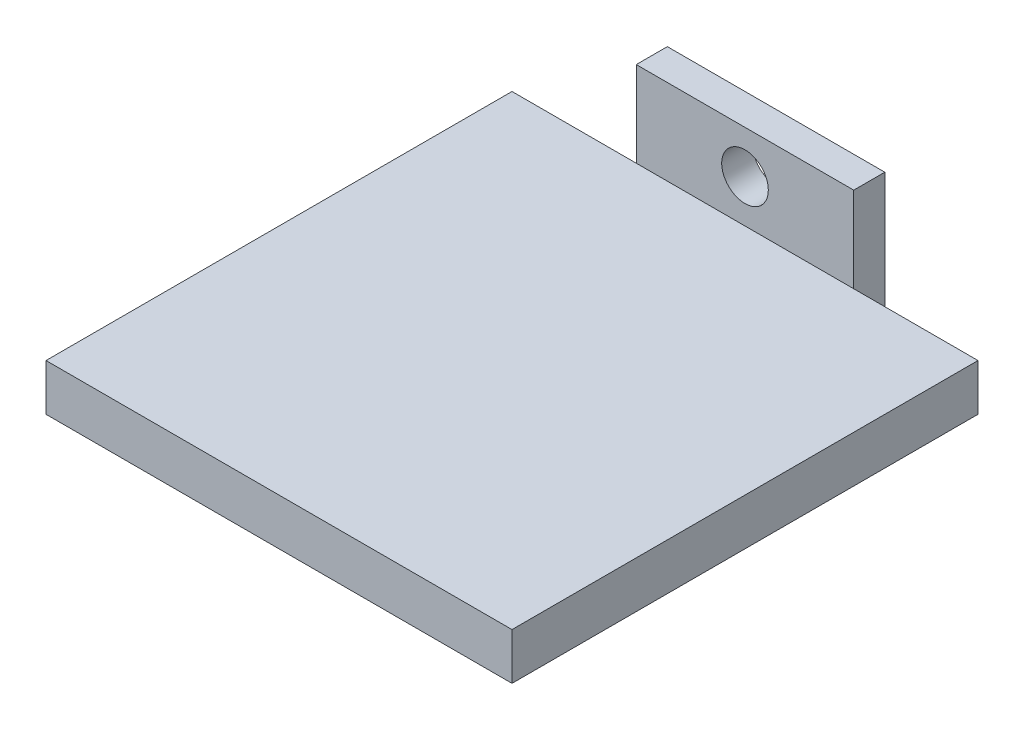
ISO-10303-21;
HEADER;
FILE_DESCRIPTION(('STEP AP214'),'2;1');
FILE_NAME('part.step','',(''),(''),'','','');
FILE_SCHEMA(('AUTOMOTIVE_DESIGN { 1 0 10303 214 1 1 1 1 }'));
ENDSEC;
DATA;
#1=APPLICATION_CONTEXT('core data for automotive mechanical design processes');
#2=APPLICATION_PROTOCOL_DEFINITION('international standard','automotive_design',2000,#1);
#3=PRODUCT_CONTEXT('',#1,'mechanical');
#4=PRODUCT('Part','Part','',(#3));
#5=PRODUCT_RELATED_PRODUCT_CATEGORY('part','',(#4));
#6=PRODUCT_DEFINITION_FORMATION('','',#4);
#7=PRODUCT_DEFINITION_CONTEXT('part definition',#1,'design');
#8=PRODUCT_DEFINITION('design','',#6,#7);
#9=PRODUCT_DEFINITION_SHAPE('','',#8);
#10=(LENGTH_UNIT() NAMED_UNIT(*) SI_UNIT(.MILLI.,.METRE.));
#11=(NAMED_UNIT(*) PLANE_ANGLE_UNIT() SI_UNIT($,.RADIAN.));
#12=(NAMED_UNIT(*) SI_UNIT($,.STERADIAN.) SOLID_ANGLE_UNIT());
#13=UNCERTAINTY_MEASURE_WITH_UNIT(LENGTH_MEASURE(1.E-05),#10,'distance_accuracy_value','');
#14=(GEOMETRIC_REPRESENTATION_CONTEXT(3) GLOBAL_UNCERTAINTY_ASSIGNED_CONTEXT((#13)) GLOBAL_UNIT_ASSIGNED_CONTEXT((#10,
#11,#12)) REPRESENTATION_CONTEXT('',''));
#15=CARTESIAN_POINT('',(0.,0.,0.));
#16=DIRECTION('',(0.,0.,1.));
#17=DIRECTION('',(1.,0.,0.));
#18=AXIS2_PLACEMENT_3D('',#15,#16,#17);
#19=CARTESIAN_POINT('',(0.,0.,2.));
#20=DIRECTION('',(0.,0.,-1.));
#21=DIRECTION('',(-1.,0.,0.));
#22=AXIS2_PLACEMENT_3D('',#19,#20,#21);
#23=PLANE('',#22);
#24=CARTESIAN_POINT('',(0.,-4.25,2.));
#25=DIRECTION('',(0.,0.,1.));
#26=DIRECTION('',(1.,0.,0.));
#27=AXIS2_PLACEMENT_3D('',#24,#25,#26);
#28=CIRCLE('',#27,1.49999999999999);
#29=CARTESIAN_POINT('',(1.49999999999997,-4.25,2.));
#30=VERTEX_POINT('',#29);
#31=EDGE_CURVE('E237',#30,#30,#28,.T.);
#32=ORIENTED_EDGE('',*,*,#31,.F.);
#33=EDGE_LOOP('',(#32));
#34=FACE_BOUND('',#33,.T.);
#35=DIRECTION('',(1.,0.,0.));
#36=VECTOR('',#35,1.);
#37=CARTESIAN_POINT('',(-15.,-1.5,2.));
#38=LINE('',#37,#36);
#39=CARTESIAN_POINT('',(-7.00000000000002,-1.5,2.));
#40=VERTEX_POINT('',#39);
#41=CARTESIAN_POINT('',(6.99999999999998,-1.5,2.));
#42=VERTEX_POINT('',#41);
#43=EDGE_CURVE('E11',#40,#42,#38,.T.);
#44=ORIENTED_EDGE('',*,*,#43,.F.);
#45=DIRECTION('',(0.,-1.,0.));
#46=VECTOR('',#45,1.);
#47=CARTESIAN_POINT('',(-7.00000000000002,-6.99999999999999,2.));
#48=LINE('',#47,#46);
#49=CARTESIAN_POINT('',(-7.00000000000002,-6.99999999999999,2.));
#50=VERTEX_POINT('',#49);
#51=EDGE_CURVE('E175',#40,#50,#48,.T.);
#52=ORIENTED_EDGE('',*,*,#51,.T.);
#53=DIRECTION('',(1.,0.,0.));
#54=VECTOR('',#53,1.);
#55=CARTESIAN_POINT('',(-7.00000000000002,-6.99999999999999,2.));
#56=LINE('',#55,#54);
#57=CARTESIAN_POINT('',(6.99999999999998,-6.99999999999999,2.));
#58=VERTEX_POINT('',#57);
#59=EDGE_CURVE('E177',#50,#58,#56,.T.);
#60=ORIENTED_EDGE('',*,*,#59,.T.);
#61=DIRECTION('',(0.,1.,0.));
#62=VECTOR('',#61,1.);
#63=CARTESIAN_POINT('',(6.99999999999998,-6.99999999999999,2.));
#64=LINE('',#63,#62);
#65=EDGE_CURVE('E163',#58,#42,#64,.T.);
#66=ORIENTED_EDGE('',*,*,#65,.T.);
#67=EDGE_LOOP('',(#44,#52,#60,#66));
#68=FACE_BOUND('',#67,.T.);
#69=ADVANCED_FACE('F44',(#34,#68),#23,.F.);
#70=CARTESIAN_POINT('',(0.,4.25,2.));
#71=DIRECTION('',(0.,0.,1.));
#72=DIRECTION('',(1.,0.,0.));
#73=AXIS2_PLACEMENT_3D('',#70,#71,#72);
#74=CIRCLE('',#73,1.49999999999999);
#75=CARTESIAN_POINT('',(1.49999999999997,4.25,2.));
#76=VERTEX_POINT('',#75);
#77=EDGE_CURVE('E222',#76,#76,#74,.T.);
#78=ORIENTED_EDGE('',*,*,#77,.F.);
#79=EDGE_LOOP('',(#78));
#80=FACE_BOUND('',#79,.T.);
#81=DIRECTION('',(-1.,0.,0.));
#82=VECTOR('',#81,1.);
#83=CARTESIAN_POINT('',(-15.,1.5,2.));
#84=LINE('',#83,#82);
#85=CARTESIAN_POINT('',(6.99999999999998,1.5,2.));
#86=VERTEX_POINT('',#85);
#87=CARTESIAN_POINT('',(-7.00000000000002,1.5,2.));
#88=VERTEX_POINT('',#87);
#89=EDGE_CURVE('E54',#86,#88,#84,.T.);
#90=ORIENTED_EDGE('',*,*,#89,.F.);
#91=CARTESIAN_POINT('',(6.99999999999998,7.00000000000001,2.));
#92=VERTEX_POINT('',#91);
#93=EDGE_CURVE('E166',#86,#92,#64,.T.);
#94=ORIENTED_EDGE('',*,*,#93,.T.);
#95=DIRECTION('',(-1.,0.,0.));
#96=VECTOR('',#95,1.);
#97=CARTESIAN_POINT('',(-7.00000000000002,7.00000000000001,2.));
#98=LINE('',#97,#96);
#99=CARTESIAN_POINT('',(-7.00000000000002,7.00000000000001,2.));
#100=VERTEX_POINT('',#99);
#101=EDGE_CURVE('E170',#92,#100,#98,.T.);
#102=ORIENTED_EDGE('',*,*,#101,.T.);
#103=EDGE_CURVE('E174',#100,#88,#48,.T.);
#104=ORIENTED_EDGE('',*,*,#103,.T.);
#105=EDGE_LOOP('',(#90,#94,#102,#104));
#106=FACE_BOUND('',#105,.T.);
#107=ADVANCED_FACE('F241',(#80,#106),#23,.F.);
#108=CARTESIAN_POINT('',(6.99999999999998,-6.99999999999999,2.));
#109=DIRECTION('',(-1.,0.,0.));
#110=DIRECTION('',(0.,0.,1.));
#111=AXIS2_PLACEMENT_3D('',#108,#109,#110);
#112=PLANE('',#111);
#113=DIRECTION('',(0.,1.,0.));
#114=VECTOR('',#113,1.);
#115=CARTESIAN_POINT('',(6.99999999999998,-6.99999999999999,0.));
#116=LINE('',#115,#114);
#117=CARTESIAN_POINT('',(6.99999999999998,-6.99999999999999,0.));
#118=VERTEX_POINT('',#117);
#119=CARTESIAN_POINT('',(6.99999999999998,7.00000000000001,0.));
#120=VERTEX_POINT('',#119);
#121=EDGE_CURVE('E153',#118,#120,#116,.T.);
#122=ORIENTED_EDGE('',*,*,#121,.T.);
#123=DIRECTION('',(0.,0.,-1.));
#124=VECTOR('',#123,1.);
#125=CARTESIAN_POINT('',(6.99999999999998,7.00000000000001,2.));
#126=LINE('',#125,#124);
#127=EDGE_CURVE('E47',#92,#120,#126,.T.);
#128=ORIENTED_EDGE('',*,*,#127,.F.);
#129=ORIENTED_EDGE('',*,*,#93,.F.);
#130=EDGE_CURVE('E169',#42,#86,#64,.T.);
#131=ORIENTED_EDGE('',*,*,#130,.F.);
#132=ORIENTED_EDGE('',*,*,#65,.F.);
#133=DIRECTION('',(0.,0.,-1.));
#134=VECTOR('',#133,1.);
#135=CARTESIAN_POINT('',(6.99999999999998,-6.99999999999999,2.));
#136=LINE('',#135,#134);
#137=EDGE_CURVE('E176',#58,#118,#136,.T.);
#138=ORIENTED_EDGE('',*,*,#137,.T.);
#139=EDGE_LOOP('',(#122,#128,#129,#131,#132,#138));
#140=FACE_BOUND('',#139,.T.);
#141=ADVANCED_FACE('F50',(#140),#112,.F.);
#142=CARTESIAN_POINT('',(-7.00000000000002,7.00000000000001,2.));
#143=DIRECTION('',(0.,-1.,0.));
#144=DIRECTION('',(0.,0.,-1.));
#145=AXIS2_PLACEMENT_3D('',#142,#143,#144);
#146=PLANE('',#145);
#147=DIRECTION('',(-1.,0.,0.));
#148=VECTOR('',#147,1.);
#149=CARTESIAN_POINT('',(-7.00000000000002,7.00000000000001,0.));
#150=LINE('',#149,#148);
#151=CARTESIAN_POINT('',(-7.00000000000002,7.00000000000001,0.));
#152=VERTEX_POINT('',#151);
#153=EDGE_CURVE('E158',#120,#152,#150,.T.);
#154=ORIENTED_EDGE('',*,*,#153,.T.);
#155=DIRECTION('',(0.,0.,-1.));
#156=VECTOR('',#155,1.);
#157=CARTESIAN_POINT('',(-7.00000000000002,7.00000000000001,2.));
#158=LINE('',#157,#156);
#159=EDGE_CURVE('E193',#100,#152,#158,.T.);
#160=ORIENTED_EDGE('',*,*,#159,.F.);
#161=ORIENTED_EDGE('',*,*,#101,.F.);
#162=ORIENTED_EDGE('',*,*,#127,.T.);
#163=EDGE_LOOP('',(#154,#160,#161,#162));
#164=FACE_BOUND('',#163,.T.);
#165=ADVANCED_FACE('F264',(#164),#146,.F.);
#166=CARTESIAN_POINT('',(-7.00000000000002,-6.99999999999999,2.));
#167=DIRECTION('',(1.,0.,0.));
#168=DIRECTION('',(0.,0.,-1.));
#169=AXIS2_PLACEMENT_3D('',#166,#167,#168);
#170=PLANE('',#169);
#171=DIRECTION('',(0.,-1.,0.));
#172=VECTOR('',#171,1.);
#173=CARTESIAN_POINT('',(-7.00000000000002,-6.99999999999999,0.));
#174=LINE('',#173,#172);
#175=CARTESIAN_POINT('',(-7.00000000000002,-6.99999999999999,0.));
#176=VERTEX_POINT('',#175);
#177=EDGE_CURVE('E181',#152,#176,#174,.T.);
#178=ORIENTED_EDGE('',*,*,#177,.T.);
#179=DIRECTION('',(0.,0.,-1.));
#180=VECTOR('',#179,1.);
#181=CARTESIAN_POINT('',(-7.00000000000002,-6.99999999999999,2.));
#182=LINE('',#181,#180);
#183=EDGE_CURVE('E195',#50,#176,#182,.T.);
#184=ORIENTED_EDGE('',*,*,#183,.F.);
#185=ORIENTED_EDGE('',*,*,#51,.F.);
#186=EDGE_CURVE('E180',#88,#40,#48,.T.);
#187=ORIENTED_EDGE('',*,*,#186,.F.);
#188=ORIENTED_EDGE('',*,*,#103,.F.);
#189=ORIENTED_EDGE('',*,*,#159,.T.);
#190=EDGE_LOOP('',(#178,#184,#185,#187,#188,#189));
#191=FACE_BOUND('',#190,.T.);
#192=ADVANCED_FACE('F265',(#191),#170,.F.);
#193=CARTESIAN_POINT('',(-7.00000000000002,-6.99999999999999,2.));
#194=DIRECTION('',(0.,1.,0.));
#195=DIRECTION('',(0.,0.,1.));
#196=AXIS2_PLACEMENT_3D('',#193,#194,#195);
#197=PLANE('',#196);
#198=DIRECTION('',(1.,0.,0.));
#199=VECTOR('',#198,1.);
#200=CARTESIAN_POINT('',(-7.00000000000002,-6.99999999999999,0.));
#201=LINE('',#200,#199);
#202=EDGE_CURVE('E187',#176,#118,#201,.T.);
#203=ORIENTED_EDGE('',*,*,#202,.T.);
#204=ORIENTED_EDGE('',*,*,#137,.F.);
#205=ORIENTED_EDGE('',*,*,#59,.F.);
#206=ORIENTED_EDGE('',*,*,#183,.T.);
#207=EDGE_LOOP('',(#203,#204,#205,#206));
#208=FACE_BOUND('',#207,.T.);
#209=ADVANCED_FACE('F256',(#208),#197,.F.);
#210=CARTESIAN_POINT('',(0.,0.,0.));
#211=DIRECTION('',(0.,0.,-1.));
#212=DIRECTION('',(-1.,0.,0.));
#213=AXIS2_PLACEMENT_3D('',#210,#211,#212);
#214=PLANE('',#213);
#215=CARTESIAN_POINT('',(0.,-4.25,0.));
#216=DIRECTION('',(0.,0.,1.));
#217=DIRECTION('',(1.,0.,0.));
#218=AXIS2_PLACEMENT_3D('',#215,#216,#217);
#219=CIRCLE('',#218,1.5);
#220=CARTESIAN_POINT('',(1.49999999999998,-4.25,0.));
#221=VERTEX_POINT('',#220);
#222=EDGE_CURVE('E235',#221,#221,#219,.T.);
#223=ORIENTED_EDGE('',*,*,#222,.T.);
#224=EDGE_LOOP('',(#223));
#225=FACE_BOUND('',#224,.T.);
#226=CARTESIAN_POINT('',(0.,4.25,0.));
#227=DIRECTION('',(0.,0.,1.));
#228=DIRECTION('',(1.,0.,0.));
#229=AXIS2_PLACEMENT_3D('',#226,#227,#228);
#230=CIRCLE('',#229,1.5);
#231=CARTESIAN_POINT('',(1.49999999999998,4.25,0.));
#232=VERTEX_POINT('',#231);
#233=EDGE_CURVE('E217',#232,#232,#230,.T.);
#234=ORIENTED_EDGE('',*,*,#233,.T.);
#235=EDGE_LOOP('',(#234));
#236=FACE_BOUND('',#235,.T.);
#237=ORIENTED_EDGE('',*,*,#121,.F.);
#238=ORIENTED_EDGE('',*,*,#202,.F.);
#239=ORIENTED_EDGE('',*,*,#177,.F.);
#240=ORIENTED_EDGE('',*,*,#153,.F.);
#241=EDGE_LOOP('',(#237,#238,#239,#240));
#242=FACE_BOUND('',#241,.T.);
#243=ADVANCED_FACE('F255',(#225,#236,#242),#214,.T.);
#244=CARTESIAN_POINT('',(0.,0.,2.));
#245=DIRECTION('',(0.,0.,-1.));
#246=DIRECTION('',(-1.,0.,0.));
#247=AXIS2_PLACEMENT_3D('',#244,#245,#246);
#248=PLANE('',#247);
#249=CARTESIAN_POINT('',(15.,-1.5,2.));
#250=VERTEX_POINT('',#249);
#251=EDGE_CURVE('E59',#42,#250,#38,.T.);
#252=ORIENTED_EDGE('',*,*,#251,.F.);
#253=ORIENTED_EDGE('',*,*,#130,.T.);
#254=CARTESIAN_POINT('',(15.,1.5,2.));
#255=VERTEX_POINT('',#254);
#256=EDGE_CURVE('E207',#255,#86,#84,.T.);
#257=ORIENTED_EDGE('',*,*,#256,.F.);
#258=DIRECTION('',(0.,1.,0.));
#259=VECTOR('',#258,1.);
#260=CARTESIAN_POINT('',(15.,-1.5,2.));
#261=LINE('',#260,#259);
#262=EDGE_CURVE('E151',#250,#255,#261,.T.);
#263=ORIENTED_EDGE('',*,*,#262,.F.);
#264=EDGE_LOOP('',(#252,#253,#257,#263));
#265=FACE_BOUND('',#264,.T.);
#266=ADVANCED_FACE('F260',(#265),#248,.T.);
#267=CARTESIAN_POINT('',(15.,-1.5,32.));
#268=DIRECTION('',(-1.,0.,0.));
#269=DIRECTION('',(0.,0.,1.));
#270=AXIS2_PLACEMENT_3D('',#267,#268,#269);
#271=PLANE('',#270);
#272=ORIENTED_EDGE('',*,*,#262,.T.);
#273=DIRECTION('',(0.,0.,-1.));
#274=VECTOR('',#273,1.);
#275=CARTESIAN_POINT('',(15.,1.5,32.));
#276=LINE('',#275,#274);
#277=CARTESIAN_POINT('',(15.,1.5,32.));
#278=VERTEX_POINT('',#277);
#279=EDGE_CURVE('E128',#278,#255,#276,.T.);
#280=ORIENTED_EDGE('',*,*,#279,.F.);
#281=DIRECTION('',(0.,1.,0.));
#282=VECTOR('',#281,1.);
#283=CARTESIAN_POINT('',(15.,-1.5,32.));
#284=LINE('',#283,#282);
#285=CARTESIAN_POINT('',(15.,-1.5,32.));
#286=VERTEX_POINT('',#285);
#287=EDGE_CURVE('E139',#286,#278,#284,.T.);
#288=ORIENTED_EDGE('',*,*,#287,.F.);
#289=DIRECTION('',(0.,0.,-1.));
#290=VECTOR('',#289,1.);
#291=CARTESIAN_POINT('',(15.,-1.5,32.));
#292=LINE('',#291,#290);
#293=EDGE_CURVE('E227',#286,#250,#292,.T.);
#294=ORIENTED_EDGE('',*,*,#293,.T.);
#295=EDGE_LOOP('',(#272,#280,#288,#294));
#296=FACE_BOUND('',#295,.T.);
#297=ADVANCED_FACE('F149',(#296),#271,.F.);
#298=CARTESIAN_POINT('',(-15.,1.5,32.));
#299=DIRECTION('',(0.,-1.,0.));
#300=DIRECTION('',(0.,0.,-1.));
#301=AXIS2_PLACEMENT_3D('',#298,#299,#300);
#302=PLANE('',#301);
#303=ORIENTED_EDGE('',*,*,#256,.T.);
#304=ORIENTED_EDGE('',*,*,#89,.T.);
#305=CARTESIAN_POINT('',(-15.,1.5,2.));
#306=VERTEX_POINT('',#305);
#307=EDGE_CURVE('E209',#88,#306,#84,.T.);
#308=ORIENTED_EDGE('',*,*,#307,.T.);
#309=DIRECTION('',(0.,0.,-1.));
#310=VECTOR('',#309,1.);
#311=CARTESIAN_POINT('',(-15.,1.5,32.));
#312=LINE('',#311,#310);
#313=CARTESIAN_POINT('',(-15.,1.5,32.));
#314=VERTEX_POINT('',#313);
#315=EDGE_CURVE('E134',#314,#306,#312,.T.);
#316=ORIENTED_EDGE('',*,*,#315,.F.);
#317=DIRECTION('',(-1.,0.,0.));
#318=VECTOR('',#317,1.);
#319=CARTESIAN_POINT('',(-15.,1.5,32.));
#320=LINE('',#319,#318);
#321=EDGE_CURVE('E123',#278,#314,#320,.T.);
#322=ORIENTED_EDGE('',*,*,#321,.F.);
#323=ORIENTED_EDGE('',*,*,#279,.T.);
#324=EDGE_LOOP('',(#303,#304,#308,#316,#322,#323));
#325=FACE_BOUND('',#324,.T.);
#326=ADVANCED_FACE('F126',(#325),#302,.F.);
#327=CARTESIAN_POINT('',(-15.,-1.5,32.));
#328=DIRECTION('',(1.,0.,0.));
#329=DIRECTION('',(0.,0.,-1.));
#330=AXIS2_PLACEMENT_3D('',#327,#328,#329);
#331=PLANE('',#330);
#332=DIRECTION('',(0.,-1.,0.));
#333=VECTOR('',#332,1.);
#334=CARTESIAN_POINT('',(-15.,-1.5,2.));
#335=LINE('',#334,#333);
#336=CARTESIAN_POINT('',(-15.,-1.5,2.));
#337=VERTEX_POINT('',#336);
#338=EDGE_CURVE('E212',#306,#337,#335,.T.);
#339=ORIENTED_EDGE('',*,*,#338,.T.);
#340=DIRECTION('',(0.,0.,-1.));
#341=VECTOR('',#340,1.);
#342=CARTESIAN_POINT('',(-15.,-1.5,32.));
#343=LINE('',#342,#341);
#344=CARTESIAN_POINT('',(-15.,-1.5,32.));
#345=VERTEX_POINT('',#344);
#346=EDGE_CURVE('E159',#345,#337,#343,.T.);
#347=ORIENTED_EDGE('',*,*,#346,.F.);
#348=DIRECTION('',(0.,-1.,0.));
#349=VECTOR('',#348,1.);
#350=CARTESIAN_POINT('',(-15.,-1.5,32.));
#351=LINE('',#350,#349);
#352=EDGE_CURVE('E140',#314,#345,#351,.T.);
#353=ORIENTED_EDGE('',*,*,#352,.F.);
#354=ORIENTED_EDGE('',*,*,#315,.T.);
#355=EDGE_LOOP('',(#339,#347,#353,#354));
#356=FACE_BOUND('',#355,.T.);
#357=ADVANCED_FACE('F318',(#356),#331,.F.);
#358=CARTESIAN_POINT('',(-15.,-1.5,32.));
#359=DIRECTION('',(0.,1.,0.));
#360=DIRECTION('',(0.,0.,1.));
#361=AXIS2_PLACEMENT_3D('',#358,#359,#360);
#362=PLANE('',#361);
#363=EDGE_CURVE('E60',#337,#40,#38,.T.);
#364=ORIENTED_EDGE('',*,*,#363,.T.);
#365=ORIENTED_EDGE('',*,*,#43,.T.);
#366=ORIENTED_EDGE('',*,*,#251,.T.);
#367=ORIENTED_EDGE('',*,*,#293,.F.);
#368=DIRECTION('',(1.,0.,0.));
#369=VECTOR('',#368,1.);
#370=CARTESIAN_POINT('',(-15.,-1.5,32.));
#371=LINE('',#370,#369);
#372=EDGE_CURVE('E141',#345,#286,#371,.T.);
#373=ORIENTED_EDGE('',*,*,#372,.F.);
#374=ORIENTED_EDGE('',*,*,#346,.T.);
#375=EDGE_LOOP('',(#364,#365,#366,#367,#373,#374));
#376=FACE_BOUND('',#375,.T.);
#377=ADVANCED_FACE('F288',(#376),#362,.F.);
#378=CARTESIAN_POINT('',(0.,0.,32.));
#379=DIRECTION('',(0.,0.,-1.));
#380=DIRECTION('',(-1.,0.,0.));
#381=AXIS2_PLACEMENT_3D('',#378,#379,#380);
#382=PLANE('',#381);
#383=ORIENTED_EDGE('',*,*,#287,.T.);
#384=ORIENTED_EDGE('',*,*,#321,.T.);
#385=ORIENTED_EDGE('',*,*,#352,.T.);
#386=ORIENTED_EDGE('',*,*,#372,.T.);
#387=EDGE_LOOP('',(#383,#384,#385,#386));
#388=FACE_BOUND('',#387,.T.);
#389=ADVANCED_FACE('F143',(#388),#382,.F.);
#390=ORIENTED_EDGE('',*,*,#307,.F.);
#391=ORIENTED_EDGE('',*,*,#186,.T.);
#392=ORIENTED_EDGE('',*,*,#363,.F.);
#393=ORIENTED_EDGE('',*,*,#338,.F.);
#394=EDGE_LOOP('',(#390,#391,#392,#393));
#395=FACE_BOUND('',#394,.T.);
#396=ADVANCED_FACE('F287',(#395),#248,.T.);
#397=CARTESIAN_POINT('',(0.,4.25,2.));
#398=DIRECTION('',(0.,0.,1.));
#399=DIRECTION('',(1.,0.,0.));
#400=AXIS2_PLACEMENT_3D('',#397,#398,#399);
#401=CYLINDRICAL_SURFACE('',#400,1.49999999999999);
#402=ORIENTED_EDGE('',*,*,#233,.F.);
#403=EDGE_LOOP('',(#402));
#404=FACE_BOUND('',#403,.T.);
#405=ORIENTED_EDGE('',*,*,#77,.T.);
#406=EDGE_LOOP('',(#405));
#407=FACE_BOUND('',#406,.T.);
#408=ADVANCED_FACE('F306',(#404,#407),#401,.F.);
#409=CARTESIAN_POINT('',(0.,-4.25,2.));
#410=DIRECTION('',(0.,0.,1.));
#411=DIRECTION('',(1.,0.,0.));
#412=AXIS2_PLACEMENT_3D('',#409,#410,#411);
#413=CYLINDRICAL_SURFACE('',#412,1.49999999999999);
#414=ORIENTED_EDGE('',*,*,#222,.F.);
#415=EDGE_LOOP('',(#414));
#416=FACE_BOUND('',#415,.T.);
#417=ORIENTED_EDGE('',*,*,#31,.T.);
#418=EDGE_LOOP('',(#417));
#419=FACE_BOUND('',#418,.T.);
#420=ADVANCED_FACE('F242',(#416,#419),#413,.F.);
#421=CLOSED_SHELL('',(#69,#107,#141,#165,#192,#209,#243,#266,#297,#326,#357,#377,#389,#396,#408,#420));
#422=MANIFOLD_SOLID_BREP('B2',#421);
#423=ADVANCED_BREP_SHAPE_REPRESENTATION('',(#18,#422),#14);
#424=SHAPE_DEFINITION_REPRESENTATION(#9,#423);
ENDSEC;
END-ISO-10303-21;
